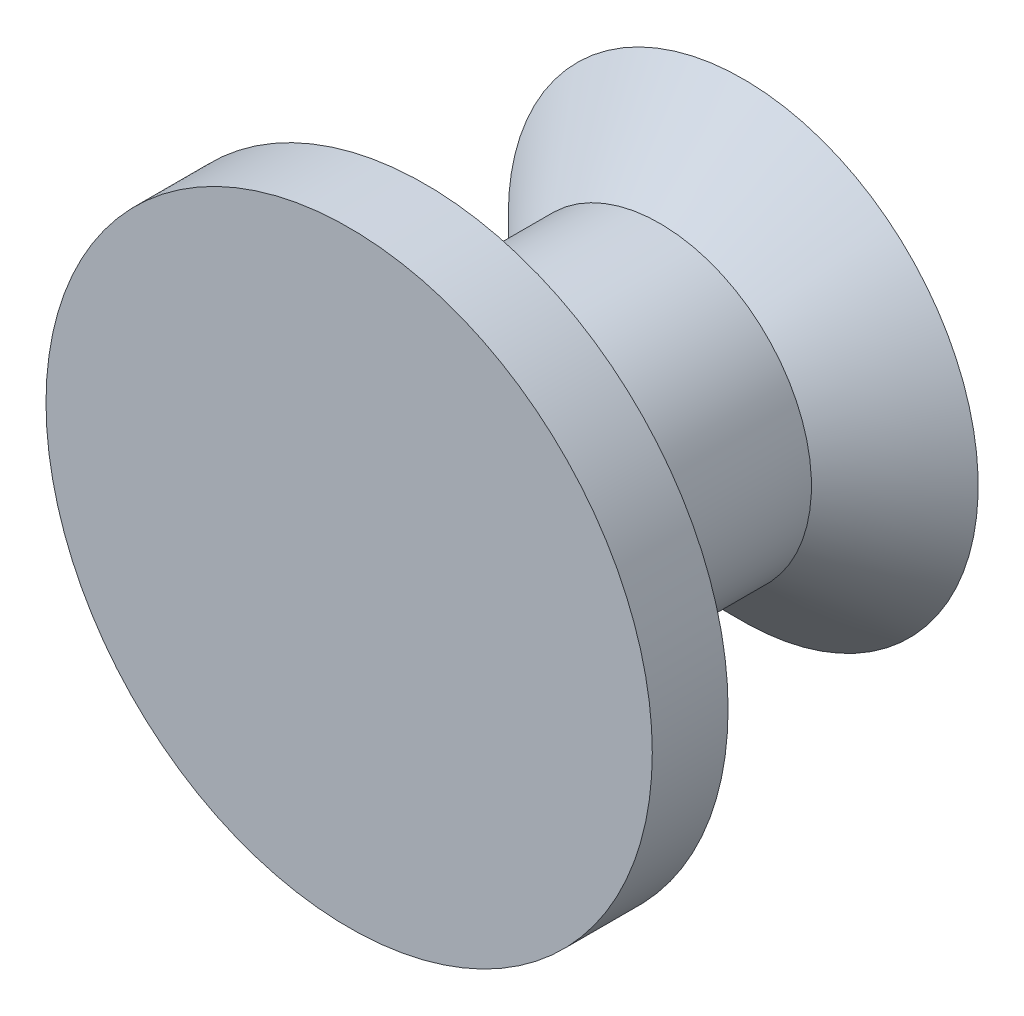
ISO-10303-21;
HEADER;
FILE_DESCRIPTION(('STEP AP214'),'2;1');
FILE_NAME('part.step','',(''),(''),'','','');
FILE_SCHEMA(('AUTOMOTIVE_DESIGN { 1 0 10303 214 1 1 1 1 }'));
ENDSEC;
DATA;
#1=APPLICATION_CONTEXT('core data for automotive mechanical design processes');
#2=APPLICATION_PROTOCOL_DEFINITION('international standard','automotive_design',2000,#1);
#3=PRODUCT_CONTEXT('',#1,'mechanical');
#4=PRODUCT('Part','Part','',(#3));
#5=PRODUCT_RELATED_PRODUCT_CATEGORY('part','',(#4));
#6=PRODUCT_DEFINITION_FORMATION('','',#4);
#7=PRODUCT_DEFINITION_CONTEXT('part definition',#1,'design');
#8=PRODUCT_DEFINITION('design','',#6,#7);
#9=PRODUCT_DEFINITION_SHAPE('','',#8);
#10=(LENGTH_UNIT() NAMED_UNIT(*) SI_UNIT(.MILLI.,.METRE.));
#11=(NAMED_UNIT(*) PLANE_ANGLE_UNIT() SI_UNIT($,.RADIAN.));
#12=(NAMED_UNIT(*) SI_UNIT($,.STERADIAN.) SOLID_ANGLE_UNIT());
#13=UNCERTAINTY_MEASURE_WITH_UNIT(LENGTH_MEASURE(1.E-05),#10,'distance_accuracy_value','');
#14=(GEOMETRIC_REPRESENTATION_CONTEXT(3) GLOBAL_UNCERTAINTY_ASSIGNED_CONTEXT((#13)) GLOBAL_UNIT_ASSIGNED_CONTEXT((#10,
#11,#12)) REPRESENTATION_CONTEXT('',''));
#15=CARTESIAN_POINT('',(0.,0.,0.));
#16=DIRECTION('',(0.,0.,1.));
#17=DIRECTION('',(1.,0.,0.));
#18=AXIS2_PLACEMENT_3D('',#15,#16,#17);
#19=CARTESIAN_POINT('',(0.,0.,0.));
#20=DIRECTION('',(0.,0.,1.));
#21=DIRECTION('',(1.,0.,0.));
#22=AXIS2_PLACEMENT_3D('',#19,#20,#21);
#23=PLANE('',#22);
#24=CARTESIAN_POINT('',(0.,0.,0.));
#25=DIRECTION('',(0.,0.,-1.));
#26=DIRECTION('',(-1.,0.,0.));
#27=AXIS2_PLACEMENT_3D('',#24,#25,#26);
#28=CIRCLE('',#27,2.);
#29=CARTESIAN_POINT('',(-2.,0.,0.));
#30=VERTEX_POINT('',#29);
#31=EDGE_CURVE('E10',#30,#30,#28,.T.);
#32=ORIENTED_EDGE('',*,*,#31,.F.);
#33=EDGE_LOOP('',(#32));
#34=FACE_BOUND('',#33,.T.);
#35=ADVANCED_FACE('F41',(#34),#23,.T.);
#36=CARTESIAN_POINT('',(0.,0.,-2.6));
#37=DIRECTION('',(0.,0.,-1.));
#38=DIRECTION('',(-1.,0.,0.));
#39=AXIS2_PLACEMENT_3D('',#36,#37,#38);
#40=CYLINDRICAL_SURFACE('',#39,2.);
#41=ORIENTED_EDGE('',*,*,#31,.T.);
#42=EDGE_LOOP('',(#41));
#43=FACE_BOUND('',#42,.T.);
#44=CARTESIAN_POINT('',(0.,0.,-0.5));
#45=DIRECTION('',(0.,0.,-1.));
#46=DIRECTION('',(-1.,0.,0.));
#47=AXIS2_PLACEMENT_3D('',#44,#45,#46);
#48=CIRCLE('',#47,2.);
#49=CARTESIAN_POINT('',(-2.,0.,-0.5));
#50=VERTEX_POINT('',#49);
#51=EDGE_CURVE('E48',#50,#50,#48,.T.);
#52=ORIENTED_EDGE('',*,*,#51,.F.);
#53=EDGE_LOOP('',(#52));
#54=FACE_BOUND('',#53,.T.);
#55=ADVANCED_FACE('F85',(#43,#54),#40,.T.);
#56=CARTESIAN_POINT('',(-2.,0.,-0.5));
#57=DIRECTION('',(0.,0.,-1.));
#58=DIRECTION('',(-1.,0.,0.));
#59=AXIS2_PLACEMENT_3D('',#56,#57,#58);
#60=PLANE('',#59);
#61=ORIENTED_EDGE('',*,*,#51,.T.);
#62=EDGE_LOOP('',(#61));
#63=FACE_BOUND('',#62,.T.);
#64=CARTESIAN_POINT('',(0.,0.,-0.5));
#65=DIRECTION('',(0.,0.,-1.));
#66=DIRECTION('',(-1.,0.,0.));
#67=AXIS2_PLACEMENT_3D('',#64,#65,#66);
#68=CIRCLE('',#67,1.);
#69=CARTESIAN_POINT('',(-1.,0.,-0.5));
#70=VERTEX_POINT('',#69);
#71=EDGE_CURVE('E53',#70,#70,#68,.T.);
#72=ORIENTED_EDGE('',*,*,#71,.F.);
#73=EDGE_LOOP('',(#72));
#74=FACE_BOUND('',#73,.T.);
#75=ADVANCED_FACE('F81',(#63,#74),#60,.T.);
#76=CARTESIAN_POINT('',(0.,0.,-2.6));
#77=DIRECTION('',(0.,0.,-1.));
#78=DIRECTION('',(-1.,0.,0.));
#79=AXIS2_PLACEMENT_3D('',#76,#77,#78);
#80=CYLINDRICAL_SURFACE('',#79,1.);
#81=ORIENTED_EDGE('',*,*,#71,.T.);
#82=EDGE_LOOP('',(#81));
#83=FACE_BOUND('',#82,.T.);
#84=CARTESIAN_POINT('',(0.,0.,-2.05000000000001));
#85=DIRECTION('',(0.,0.,-1.));
#86=DIRECTION('',(-1.,0.,0.));
#87=AXIS2_PLACEMENT_3D('',#84,#85,#86);
#88=CIRCLE('',#87,1.);
#89=CARTESIAN_POINT('',(-1.,0.,-2.05000000000001));
#90=VERTEX_POINT('',#89);
#91=EDGE_CURVE('E58',#90,#90,#88,.T.);
#92=ORIENTED_EDGE('',*,*,#91,.F.);
#93=EDGE_LOOP('',(#92));
#94=FACE_BOUND('',#93,.T.);
#95=ADVANCED_FACE('F73',(#83,#94),#80,.T.);
#96=CARTESIAN_POINT('',(0.,0.,-2.6));
#97=DIRECTION('',(0.,0.,-1.));
#98=DIRECTION('',(-1.,0.,0.));
#99=AXIS2_PLACEMENT_3D('',#96,#97,#98);
#100=CONICAL_SURFACE('',#99,1.55,0.785398163397454);
#101=ORIENTED_EDGE('',*,*,#91,.T.);
#102=EDGE_LOOP('',(#101));
#103=FACE_BOUND('',#102,.T.);
#104=CARTESIAN_POINT('',(0.,0.,-2.6));
#105=DIRECTION('',(0.,0.,-1.));
#106=DIRECTION('',(-1.,0.,0.));
#107=AXIS2_PLACEMENT_3D('',#104,#105,#106);
#108=CIRCLE('',#107,1.55);
#109=CARTESIAN_POINT('',(-1.55,0.,-2.6));
#110=VERTEX_POINT('',#109);
#111=EDGE_CURVE('E64',#110,#110,#108,.T.);
#112=ORIENTED_EDGE('',*,*,#111,.F.);
#113=EDGE_LOOP('',(#112));
#114=FACE_BOUND('',#113,.T.);
#115=ADVANCED_FACE('F71',(#103,#114),#100,.T.);
#116=CARTESIAN_POINT('',(-1.55,0.,-2.6));
#117=DIRECTION('',(0.,0.,-1.));
#118=DIRECTION('',(-1.,0.,0.));
#119=AXIS2_PLACEMENT_3D('',#116,#117,#118);
#120=PLANE('',#119);
#121=ORIENTED_EDGE('',*,*,#111,.T.);
#122=EDGE_LOOP('',(#121));
#123=FACE_BOUND('',#122,.T.);
#124=ADVANCED_FACE('F69',(#123),#120,.T.);
#125=CLOSED_SHELL('',(#35,#55,#75,#95,#115,#124));
#126=MANIFOLD_SOLID_BREP('B2',#125);
#127=ADVANCED_BREP_SHAPE_REPRESENTATION('',(#18,#126),#14);
#128=SHAPE_DEFINITION_REPRESENTATION(#9,#127);
ENDSEC;
END-ISO-10303-21;
